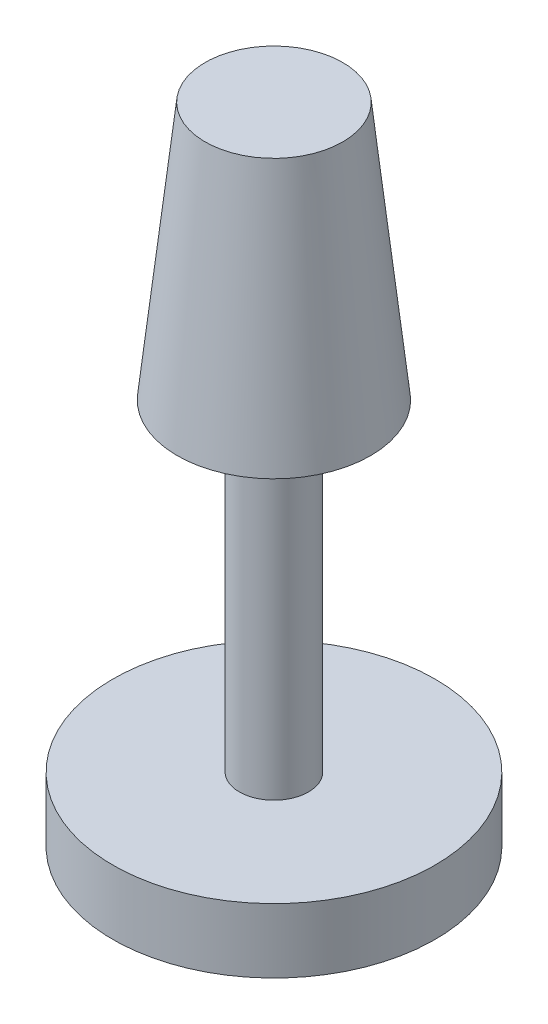
ISO-10303-21;
HEADER;
FILE_DESCRIPTION(('STEP AP214'),'2;1');
FILE_NAME('part.step','',(''),(''),'','','');
FILE_SCHEMA(('AUTOMOTIVE_DESIGN { 1 0 10303 214 1 1 1 1 }'));
ENDSEC;
DATA;
#1=APPLICATION_CONTEXT('core data for automotive mechanical design processes');
#2=APPLICATION_PROTOCOL_DEFINITION('international standard','automotive_design',2000,#1);
#3=PRODUCT_CONTEXT('',#1,'mechanical');
#4=PRODUCT('Part','Part','',(#3));
#5=PRODUCT_RELATED_PRODUCT_CATEGORY('part','',(#4));
#6=PRODUCT_DEFINITION_FORMATION('','',#4);
#7=PRODUCT_DEFINITION_CONTEXT('part definition',#1,'design');
#8=PRODUCT_DEFINITION('design','',#6,#7);
#9=PRODUCT_DEFINITION_SHAPE('','',#8);
#10=(LENGTH_UNIT() NAMED_UNIT(*) SI_UNIT(.MILLI.,.METRE.));
#11=(NAMED_UNIT(*) PLANE_ANGLE_UNIT() SI_UNIT($,.RADIAN.));
#12=(NAMED_UNIT(*) SI_UNIT($,.STERADIAN.) SOLID_ANGLE_UNIT());
#13=UNCERTAINTY_MEASURE_WITH_UNIT(LENGTH_MEASURE(1.E-05),#10,'distance_accuracy_value','');
#14=(GEOMETRIC_REPRESENTATION_CONTEXT(3) GLOBAL_UNCERTAINTY_ASSIGNED_CONTEXT((#13)) GLOBAL_UNIT_ASSIGNED_CONTEXT((#10,
#11,#12)) REPRESENTATION_CONTEXT('',''));
#15=CARTESIAN_POINT('',(0.,0.,0.));
#16=DIRECTION('',(0.,0.,1.));
#17=DIRECTION('',(1.,0.,0.));
#18=AXIS2_PLACEMENT_3D('',#15,#16,#17);
#19=CARTESIAN_POINT('',(0.,11.3527679188282,0.));
#20=DIRECTION('',(0.,1.,0.));
#21=DIRECTION('',(-1.,0.,0.));
#22=AXIS2_PLACEMENT_3D('',#19,#20,#21);
#23=PLANE('',#22);
#24=CARTESIAN_POINT('',(0.,11.3527679188282,0.));
#25=DIRECTION('',(0.,-1.,0.));
#26=DIRECTION('',(1.,0.,0.));
#27=AXIS2_PLACEMENT_3D('',#24,#25,#26);
#28=CIRCLE('',#27,2.135);
#29=CARTESIAN_POINT('',(2.135,11.3527679188282,0.));
#30=VERTEX_POINT('',#29);
#31=EDGE_CURVE('E42',#30,#30,#28,.T.);
#32=ORIENTED_EDGE('',*,*,#31,.F.);
#33=EDGE_LOOP('',(#32));
#34=FACE_BOUND('',#33,.T.);
#35=ADVANCED_FACE('F40',(#34),#23,.T.);
#36=CARTESIAN_POINT('',(0.,3.35276791882822,0.));
#37=DIRECTION('',(0.,-1.,0.));
#38=DIRECTION('',(1.,0.,0.));
#39=AXIS2_PLACEMENT_3D('',#36,#37,#38);
#40=CONICAL_SURFACE('',#39,3.,0.107706567553583);
#41=ORIENTED_EDGE('',*,*,#31,.T.);
#42=EDGE_LOOP('',(#41));
#43=FACE_BOUND('',#42,.T.);
#44=CARTESIAN_POINT('',(0.,3.35276791882822,0.));
#45=DIRECTION('',(0.,-1.,0.));
#46=DIRECTION('',(1.,0.,0.));
#47=AXIS2_PLACEMENT_3D('',#44,#45,#46);
#48=CIRCLE('',#47,3.);
#49=CARTESIAN_POINT('',(3.,3.35276791882822,0.));
#50=VERTEX_POINT('',#49);
#51=EDGE_CURVE('E48',#50,#50,#48,.T.);
#52=ORIENTED_EDGE('',*,*,#51,.F.);
#53=EDGE_LOOP('',(#52));
#54=FACE_BOUND('',#53,.T.);
#55=ADVANCED_FACE('F80',(#43,#54),#40,.T.);
#56=CARTESIAN_POINT('',(3.,3.35276791882822,0.));
#57=DIRECTION('',(0.,-1.,0.));
#58=DIRECTION('',(1.,0.,0.));
#59=AXIS2_PLACEMENT_3D('',#56,#57,#58);
#60=PLANE('',#59);
#61=ORIENTED_EDGE('',*,*,#51,.T.);
#62=EDGE_LOOP('',(#61));
#63=FACE_BOUND('',#62,.T.);
#64=CARTESIAN_POINT('',(0.,3.35276791882822,0.));
#65=DIRECTION('',(0.,-1.,0.));
#66=DIRECTION('',(1.,0.,0.));
#67=AXIS2_PLACEMENT_3D('',#64,#65,#66);
#68=CIRCLE('',#67,1.07167607664414);
#69=CARTESIAN_POINT('',(1.07167607664414,3.35276791882822,0.));
#70=VERTEX_POINT('',#69);
#71=EDGE_CURVE('E55',#70,#70,#68,.T.);
#72=ORIENTED_EDGE('',*,*,#71,.F.);
#73=EDGE_LOOP('',(#72));
#74=FACE_BOUND('',#73,.T.);
#75=ADVANCED_FACE('F85',(#63,#74),#60,.T.);
#76=CARTESIAN_POINT('',(0.,-8.64723208117178,0.));
#77=DIRECTION('',(0.,-1.,0.));
#78=DIRECTION('',(1.,0.,0.));
#79=AXIS2_PLACEMENT_3D('',#76,#77,#78);
#80=CYLINDRICAL_SURFACE('',#79,1.07167607664414);
#81=CARTESIAN_POINT('',(0.,-6.64723208117178,0.));
#82=DIRECTION('',(0.,1.,0.));
#83=DIRECTION('',(0.,0.,1.));
#84=AXIS2_PLACEMENT_3D('',#81,#82,#83);
#85=CIRCLE('',#84,1.07167607664414);
#86=CARTESIAN_POINT('',(0.,-6.64723208117178,1.07167607664414));
#87=VERTEX_POINT('',#86);
#88=EDGE_CURVE('E10',#87,#87,#85,.F.);
#89=ORIENTED_EDGE('',*,*,#88,.F.);
#90=EDGE_LOOP('',(#89));
#91=FACE_BOUND('',#90,.T.);
#92=ORIENTED_EDGE('',*,*,#71,.T.);
#93=EDGE_LOOP('',(#92));
#94=FACE_BOUND('',#93,.T.);
#95=ADVANCED_FACE('F74',(#91,#94),#80,.T.);
#96=CARTESIAN_POINT('',(0.,-6.64723208117178,0.));
#97=DIRECTION('',(0.,1.,0.));
#98=DIRECTION('',(0.,0.,1.));
#99=AXIS2_PLACEMENT_3D('',#96,#97,#98);
#100=PLANE('',#99);
#101=ORIENTED_EDGE('',*,*,#88,.T.);
#102=EDGE_LOOP('',(#101));
#103=FACE_BOUND('',#102,.T.);
#104=CARTESIAN_POINT('',(0.,-6.64723208117178,0.));
#105=DIRECTION('',(0.,-1.,0.));
#106=DIRECTION('',(0.,0.,-1.));
#107=AXIS2_PLACEMENT_3D('',#104,#105,#106);
#108=CIRCLE('',#107,5.);
#109=CARTESIAN_POINT('',(0.,-6.64723208117178,-5.));
#110=VERTEX_POINT('',#109);
#111=EDGE_CURVE('E60',#110,#110,#108,.T.);
#112=ORIENTED_EDGE('',*,*,#111,.F.);
#113=EDGE_LOOP('',(#112));
#114=FACE_BOUND('',#113,.T.);
#115=ADVANCED_FACE('F70',(#103,#114),#100,.T.);
#116=CARTESIAN_POINT('',(0.,-8.64723208117178,0.));
#117=DIRECTION('',(0.,-1.,0.));
#118=DIRECTION('',(0.,0.,-1.));
#119=AXIS2_PLACEMENT_3D('',#116,#117,#118);
#120=CYLINDRICAL_SURFACE('',#119,5.);
#121=ORIENTED_EDGE('',*,*,#111,.T.);
#122=EDGE_LOOP('',(#121));
#123=FACE_BOUND('',#122,.T.);
#124=CARTESIAN_POINT('',(0.,-8.64723208117178,0.));
#125=DIRECTION('',(0.,-1.,0.));
#126=DIRECTION('',(0.,0.,-1.));
#127=AXIS2_PLACEMENT_3D('',#124,#125,#126);
#128=CIRCLE('',#127,5.);
#129=CARTESIAN_POINT('',(0.,-8.64723208117178,-5.));
#130=VERTEX_POINT('',#129);
#131=EDGE_CURVE('E58',#130,#130,#128,.T.);
#132=ORIENTED_EDGE('',*,*,#131,.F.);
#133=EDGE_LOOP('',(#132));
#134=FACE_BOUND('',#133,.T.);
#135=ADVANCED_FACE('F63',(#123,#134),#120,.T.);
#136=CARTESIAN_POINT('',(1.07167607664414,-8.64723208117178,0.));
#137=DIRECTION('',(0.,-1.,0.));
#138=DIRECTION('',(1.,0.,0.));
#139=AXIS2_PLACEMENT_3D('',#136,#137,#138);
#140=PLANE('',#139);
#141=ORIENTED_EDGE('',*,*,#131,.T.);
#142=EDGE_LOOP('',(#141));
#143=FACE_BOUND('',#142,.T.);
#144=ADVANCED_FACE('F39',(#143),#140,.T.);
#145=CLOSED_SHELL('',(#35,#55,#75,#95,#115,#135,#144));
#146=MANIFOLD_SOLID_BREP('B2',#145);
#147=ADVANCED_BREP_SHAPE_REPRESENTATION('',(#18,#146),#14);
#148=SHAPE_DEFINITION_REPRESENTATION(#9,#147);
ENDSEC;
END-ISO-10303-21;
